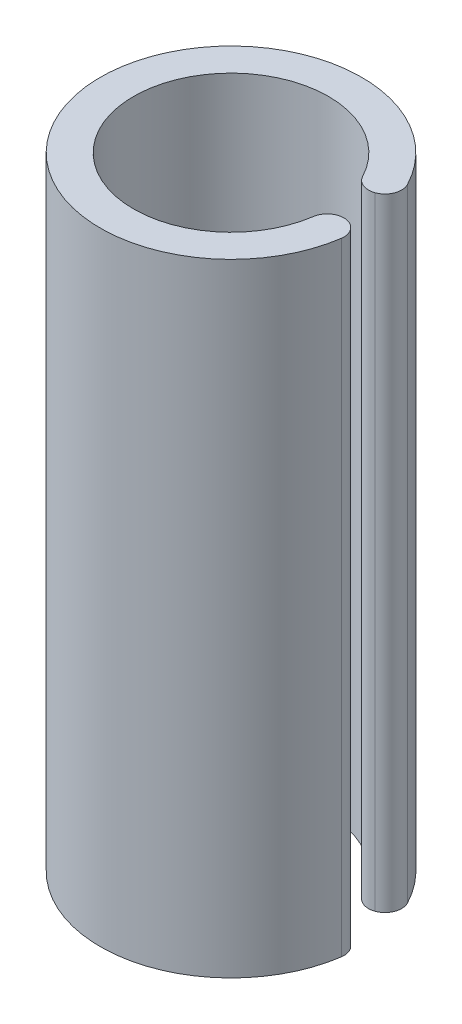
ISO-10303-21;
HEADER;
FILE_DESCRIPTION(('STEP AP214'),'2;1');
FILE_NAME('part.step','',(''),(''),'','','');
FILE_SCHEMA(('AUTOMOTIVE_DESIGN { 1 0 10303 214 1 1 1 1 }'));
ENDSEC;
DATA;
#1=APPLICATION_CONTEXT('core data for automotive mechanical design processes');
#2=APPLICATION_PROTOCOL_DEFINITION('international standard','automotive_design',2000,#1);
#3=PRODUCT_CONTEXT('',#1,'mechanical');
#4=PRODUCT('Part','Part','',(#3));
#5=PRODUCT_RELATED_PRODUCT_CATEGORY('part','',(#4));
#6=PRODUCT_DEFINITION_FORMATION('','',#4);
#7=PRODUCT_DEFINITION_CONTEXT('part definition',#1,'design');
#8=PRODUCT_DEFINITION('design','',#6,#7);
#9=PRODUCT_DEFINITION_SHAPE('','',#8);
#10=(LENGTH_UNIT() NAMED_UNIT(*) SI_UNIT(.MILLI.,.METRE.));
#11=(NAMED_UNIT(*) PLANE_ANGLE_UNIT() SI_UNIT($,.RADIAN.));
#12=(NAMED_UNIT(*) SI_UNIT($,.STERADIAN.) SOLID_ANGLE_UNIT());
#13=UNCERTAINTY_MEASURE_WITH_UNIT(LENGTH_MEASURE(1.E-05),#10,'distance_accuracy_value','');
#14=(GEOMETRIC_REPRESENTATION_CONTEXT(3) GLOBAL_UNCERTAINTY_ASSIGNED_CONTEXT((#13)) GLOBAL_UNIT_ASSIGNED_CONTEXT((#10,
#11,#12)) REPRESENTATION_CONTEXT('',''));
#15=CARTESIAN_POINT('',(0.,0.,0.));
#16=DIRECTION('',(0.,0.,1.));
#17=DIRECTION('',(1.,0.,0.));
#18=AXIS2_PLACEMENT_3D('',#15,#16,#17);
#19=CARTESIAN_POINT('',(0.,15.,0.));
#20=DIRECTION('',(0.,-1.,0.));
#21=DIRECTION('',(0.,0.,-1.));
#22=AXIS2_PLACEMENT_3D('',#19,#20,#21);
#23=CYLINDRICAL_SURFACE('',#22,2.35);
#24=CARTESIAN_POINT('',(0.,15.,0.));
#25=DIRECTION('',(0.,-1.,0.));
#26=DIRECTION('',(0.,0.,1.));
#27=AXIS2_PLACEMENT_3D('',#24,#25,#26);
#28=CIRCLE('',#27,2.35);
#29=CARTESIAN_POINT('',(2.32500759796146,15.,0.341818181818182));
#30=VERTEX_POINT('',#29);
#31=CARTESIAN_POINT('',(2.08131732642298,15.,-1.09115452009855));
#32=VERTEX_POINT('',#31);
#33=EDGE_CURVE('E98',#30,#32,#28,.T.);
#34=ORIENTED_EDGE('',*,*,#33,.F.);
#35=DIRECTION('',(0.,-1.,0.));
#36=VECTOR('',#35,1.);
#37=CARTESIAN_POINT('',(2.32500759796146,15.,0.341818181818182));
#38=LINE('',#37,#36);
#39=CARTESIAN_POINT('',(2.32500759796146,0.,0.341818181818182));
#40=VERTEX_POINT('',#39);
#41=EDGE_CURVE('E11',#30,#40,#38,.T.);
#42=ORIENTED_EDGE('',*,*,#41,.T.);
#43=CARTESIAN_POINT('',(0.,0.,0.));
#44=DIRECTION('',(0.,-1.,0.));
#45=DIRECTION('',(0.,0.,1.));
#46=AXIS2_PLACEMENT_3D('',#43,#44,#45);
#47=CIRCLE('',#46,2.35);
#48=CARTESIAN_POINT('',(2.08131732642298,0.,-1.09115452009855));
#49=VERTEX_POINT('',#48);
#50=EDGE_CURVE('E96',#40,#49,#47,.T.);
#51=ORIENTED_EDGE('',*,*,#50,.T.);
#52=DIRECTION('',(0.,-1.,0.));
#53=VECTOR('',#52,1.);
#54=CARTESIAN_POINT('',(2.08131732642298,15.,-1.09115452009855));
#55=LINE('',#54,#53);
#56=EDGE_CURVE('E49',#49,#32,#55,.F.);
#57=ORIENTED_EDGE('',*,*,#56,.T.);
#58=EDGE_LOOP('',(#34,#42,#51,#57));
#59=FACE_BOUND('',#58,.T.);
#60=ADVANCED_FACE('F39',(#59),#23,.F.);
#61=CARTESIAN_POINT('',(0.,15.,0.));
#62=DIRECTION('',(0.,-1.,0.));
#63=DIRECTION('',(0.,0.,-1.));
#64=AXIS2_PLACEMENT_3D('',#61,#62,#63);
#65=CYLINDRICAL_SURFACE('',#64,3.15);
#66=CARTESIAN_POINT('',(0.,0.,0.));
#67=DIRECTION('',(0.,1.,0.));
#68=DIRECTION('',(0.,0.,1.));
#69=AXIS2_PLACEMENT_3D('',#66,#67,#68);
#70=CIRCLE('',#69,3.15);
#71=CARTESIAN_POINT('',(2.78985088435421,0.,-1.46261137800444));
#72=VERTEX_POINT('',#71);
#73=CARTESIAN_POINT('',(3.11649954620366,0.,0.458181818181818));
#74=VERTEX_POINT('',#73);
#75=EDGE_CURVE('E108',#72,#74,#70,.T.);
#76=ORIENTED_EDGE('',*,*,#75,.T.);
#77=DIRECTION('',(0.,-1.,0.));
#78=VECTOR('',#77,1.);
#79=CARTESIAN_POINT('',(3.11649954620366,15.,0.458181818181818));
#80=LINE('',#79,#78);
#81=CARTESIAN_POINT('',(3.11649954620366,15.,0.458181818181818));
#82=VERTEX_POINT('',#81);
#83=EDGE_CURVE('E127',#74,#82,#80,.F.);
#84=ORIENTED_EDGE('',*,*,#83,.T.);
#85=CARTESIAN_POINT('',(0.,15.,0.));
#86=DIRECTION('',(0.,1.,0.));
#87=DIRECTION('',(0.,0.,1.));
#88=AXIS2_PLACEMENT_3D('',#85,#86,#87);
#89=CIRCLE('',#88,3.15);
#90=CARTESIAN_POINT('',(2.78985088435421,15.,-1.46261137800444));
#91=VERTEX_POINT('',#90);
#92=EDGE_CURVE('E154',#91,#82,#89,.T.);
#93=ORIENTED_EDGE('',*,*,#92,.F.);
#94=DIRECTION('',(0.,-1.,0.));
#95=VECTOR('',#94,1.);
#96=CARTESIAN_POINT('',(2.78985088435421,15.,-1.46261137800444));
#97=LINE('',#96,#95);
#98=EDGE_CURVE('E119',#91,#72,#97,.T.);
#99=ORIENTED_EDGE('',*,*,#98,.T.);
#100=EDGE_LOOP('',(#76,#84,#93,#99));
#101=FACE_BOUND('',#100,.T.);
#102=ADVANCED_FACE('F157',(#101),#65,.T.);
#103=CARTESIAN_POINT('',(0.,15.,0.));
#104=DIRECTION('',(0.,1.,0.));
#105=DIRECTION('',(0.,0.,1.));
#106=AXIS2_PLACEMENT_3D('',#103,#104,#105);
#107=PLANE('',#106);
#108=ORIENTED_EDGE('',*,*,#92,.T.);
#109=CARTESIAN_POINT('',(2.72075357208256,15.,0.4));
#110=DIRECTION('',(0.,1.,0.));
#111=DIRECTION('',(0.,0.,1.));
#112=AXIS2_PLACEMENT_3D('',#109,#110,#111);
#113=CIRCLE('',#112,0.4);
#114=CARTESIAN_POINT('',(2.72075357208256,15.,0.));
#115=VERTEX_POINT('',#114);
#116=EDGE_CURVE('E57',#82,#115,#113,.T.);
#117=ORIENTED_EDGE('',*,*,#116,.T.);
#118=CARTESIAN_POINT('',(2.72075357208256,15.,0.4));
#119=DIRECTION('',(0.,1.,0.));
#120=DIRECTION('',(0.,0.,1.));
#121=AXIS2_PLACEMENT_3D('',#118,#119,#120);
#122=CIRCLE('',#121,0.4);
#123=EDGE_CURVE('E136',#115,#30,#122,.T.);
#124=ORIENTED_EDGE('',*,*,#123,.T.);
#125=ORIENTED_EDGE('',*,*,#33,.T.);
#126=CARTESIAN_POINT('',(2.4355841053886,15.,-1.27688294905149));
#127=DIRECTION('',(0.,1.,0.));
#128=DIRECTION('',(0.,0.,1.));
#129=AXIS2_PLACEMENT_3D('',#126,#127,#128);
#130=CIRCLE('',#129,0.4);
#131=CARTESIAN_POINT('',(2.57289376086639,15.,-0.90118884673876));
#132=VERTEX_POINT('',#131);
#133=EDGE_CURVE('E64',#32,#132,#130,.T.);
#134=ORIENTED_EDGE('',*,*,#133,.T.);
#135=CARTESIAN_POINT('',(2.4355841053886,15.,-1.27688294905149));
#136=DIRECTION('',(0.,1.,0.));
#137=DIRECTION('',(0.,0.,1.));
#138=AXIS2_PLACEMENT_3D('',#135,#136,#137);
#139=CIRCLE('',#138,0.4);
#140=EDGE_CURVE('E131',#132,#91,#139,.T.);
#141=ORIENTED_EDGE('',*,*,#140,.T.);
#142=EDGE_LOOP('',(#108,#117,#124,#125,#134,#141));
#143=FACE_BOUND('',#142,.T.);
#144=ADVANCED_FACE('F153',(#143),#107,.T.);
#145=CARTESIAN_POINT('',(0.,0.,0.));
#146=DIRECTION('',(0.,1.,0.));
#147=DIRECTION('',(0.,0.,1.));
#148=AXIS2_PLACEMENT_3D('',#145,#146,#147);
#149=PLANE('',#148);
#150=CARTESIAN_POINT('',(2.72075357208256,0.,0.4));
#151=DIRECTION('',(0.,1.,0.));
#152=DIRECTION('',(0.,0.,1.));
#153=AXIS2_PLACEMENT_3D('',#150,#151,#152);
#154=CIRCLE('',#153,0.4);
#155=CARTESIAN_POINT('',(2.72075357208256,0.,0.));
#156=VERTEX_POINT('',#155);
#157=EDGE_CURVE('E103',#40,#156,#154,.F.);
#158=ORIENTED_EDGE('',*,*,#157,.T.);
#159=CARTESIAN_POINT('',(2.72075357208256,0.,0.4));
#160=DIRECTION('',(0.,1.,0.));
#161=DIRECTION('',(0.,0.,1.));
#162=AXIS2_PLACEMENT_3D('',#159,#160,#161);
#163=CIRCLE('',#162,0.4);
#164=EDGE_CURVE('E115',#156,#74,#163,.F.);
#165=ORIENTED_EDGE('',*,*,#164,.T.);
#166=ORIENTED_EDGE('',*,*,#75,.F.);
#167=CARTESIAN_POINT('',(2.4355841053886,0.,-1.27688294905149));
#168=DIRECTION('',(0.,1.,0.));
#169=DIRECTION('',(0.,0.,1.));
#170=AXIS2_PLACEMENT_3D('',#167,#168,#169);
#171=CIRCLE('',#170,0.4);
#172=CARTESIAN_POINT('',(2.57289376086639,0.,-0.90118884673876));
#173=VERTEX_POINT('',#172);
#174=EDGE_CURVE('E121',#72,#173,#171,.F.);
#175=ORIENTED_EDGE('',*,*,#174,.T.);
#176=CARTESIAN_POINT('',(2.4355841053886,0.,-1.27688294905149));
#177=DIRECTION('',(0.,1.,0.));
#178=DIRECTION('',(0.,0.,1.));
#179=AXIS2_PLACEMENT_3D('',#176,#177,#178);
#180=CIRCLE('',#179,0.4);
#181=EDGE_CURVE('E106',#173,#49,#180,.F.);
#182=ORIENTED_EDGE('',*,*,#181,.T.);
#183=ORIENTED_EDGE('',*,*,#50,.F.);
#184=EDGE_LOOP('',(#158,#165,#166,#175,#182,#183));
#185=FACE_BOUND('',#184,.T.);
#186=ADVANCED_FACE('F102',(#185),#149,.F.);
#187=CARTESIAN_POINT('',(2.72075357208256,15.,0.4));
#188=DIRECTION('',(0.,-1.,0.));
#189=DIRECTION('',(0.,0.,-1.));
#190=AXIS2_PLACEMENT_3D('',#187,#188,#189);
#191=CYLINDRICAL_SURFACE('',#190,0.4);
#192=ORIENTED_EDGE('',*,*,#41,.F.);
#193=ORIENTED_EDGE('',*,*,#123,.F.);
#194=DIRECTION('',(0.,-1.,0.));
#195=VECTOR('',#194,1.);
#196=CARTESIAN_POINT('',(2.72075357208256,15.,0.));
#197=LINE('',#196,#195);
#198=EDGE_CURVE('E109',#156,#115,#197,.F.);
#199=ORIENTED_EDGE('',*,*,#198,.F.);
#200=ORIENTED_EDGE('',*,*,#157,.F.);
#201=EDGE_LOOP('',(#192,#193,#199,#200));
#202=FACE_BOUND('',#201,.T.);
#203=ADVANCED_FACE('F111',(#202),#191,.T.);
#204=CARTESIAN_POINT('',(2.72075357208256,15.,0.4));
#205=DIRECTION('',(0.,-1.,0.));
#206=DIRECTION('',(0.,0.,-1.));
#207=AXIS2_PLACEMENT_3D('',#204,#205,#206);
#208=CYLINDRICAL_SURFACE('',#207,0.4);
#209=ORIENTED_EDGE('',*,*,#116,.F.);
#210=ORIENTED_EDGE('',*,*,#83,.F.);
#211=ORIENTED_EDGE('',*,*,#164,.F.);
#212=ORIENTED_EDGE('',*,*,#198,.T.);
#213=EDGE_LOOP('',(#209,#210,#211,#212));
#214=FACE_BOUND('',#213,.T.);
#215=ADVANCED_FACE('F167',(#214),#208,.T.);
#216=CARTESIAN_POINT('',(2.4355841053886,15.,-1.27688294905149));
#217=DIRECTION('',(0.,-1.,0.));
#218=DIRECTION('',(0.,0.,-1.));
#219=AXIS2_PLACEMENT_3D('',#216,#217,#218);
#220=CYLINDRICAL_SURFACE('',#219,0.4);
#221=ORIENTED_EDGE('',*,*,#98,.F.);
#222=ORIENTED_EDGE('',*,*,#140,.F.);
#223=DIRECTION('',(0.,-1.,0.));
#224=VECTOR('',#223,1.);
#225=CARTESIAN_POINT('',(2.57289376086639,15.,-0.90118884673876));
#226=LINE('',#225,#224);
#227=EDGE_CURVE('E43',#173,#132,#226,.F.);
#228=ORIENTED_EDGE('',*,*,#227,.F.);
#229=ORIENTED_EDGE('',*,*,#174,.F.);
#230=EDGE_LOOP('',(#221,#222,#228,#229));
#231=FACE_BOUND('',#230,.T.);
#232=ADVANCED_FACE('F41',(#231),#220,.T.);
#233=CARTESIAN_POINT('',(2.4355841053886,15.,-1.27688294905149));
#234=DIRECTION('',(0.,-1.,0.));
#235=DIRECTION('',(0.,0.,-1.));
#236=AXIS2_PLACEMENT_3D('',#233,#234,#235);
#237=CYLINDRICAL_SURFACE('',#236,0.4);
#238=ORIENTED_EDGE('',*,*,#133,.F.);
#239=ORIENTED_EDGE('',*,*,#56,.F.);
#240=ORIENTED_EDGE('',*,*,#181,.F.);
#241=ORIENTED_EDGE('',*,*,#227,.T.);
#242=EDGE_LOOP('',(#238,#239,#240,#241));
#243=FACE_BOUND('',#242,.T.);
#244=ADVANCED_FACE('F148',(#243),#237,.T.);
#245=CLOSED_SHELL('',(#60,#102,#144,#186,#203,#215,#232,#244));
#246=MANIFOLD_SOLID_BREP('B2',#245);
#247=ADVANCED_BREP_SHAPE_REPRESENTATION('',(#18,#246),#14);
#248=SHAPE_DEFINITION_REPRESENTATION(#9,#247);
ENDSEC;
END-ISO-10303-21;
